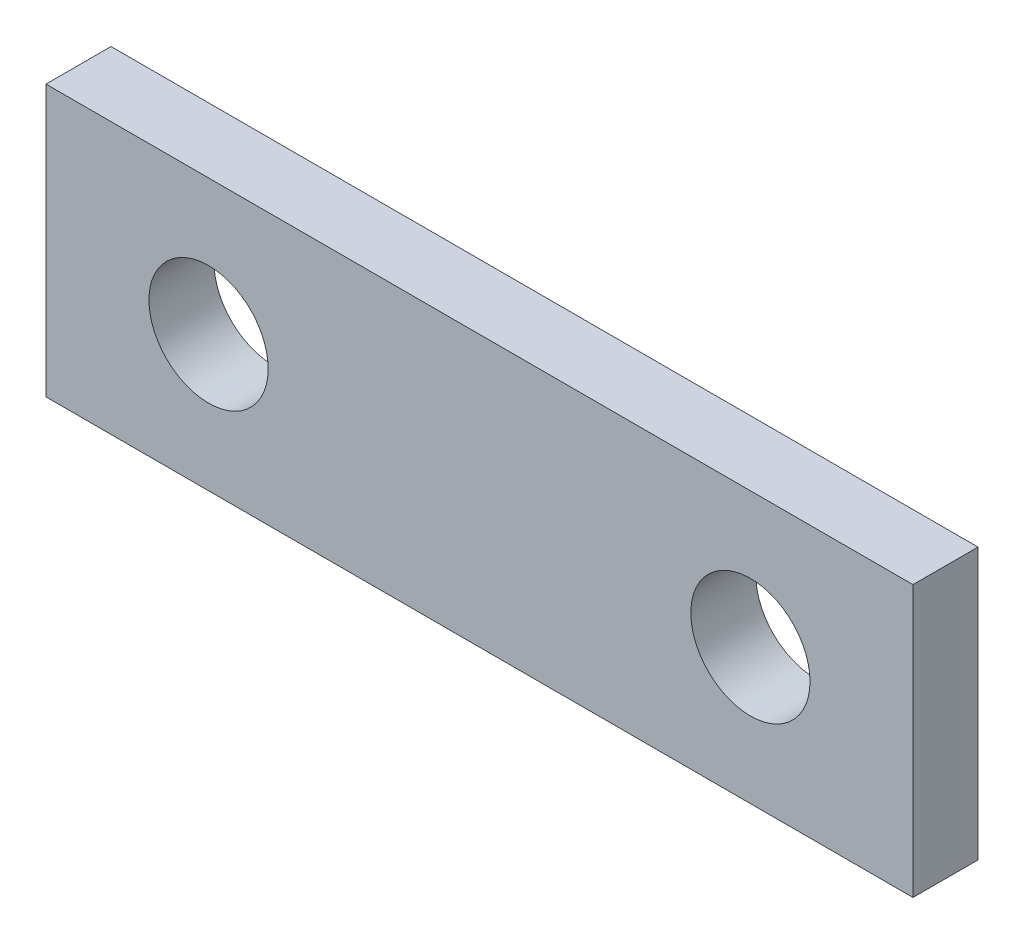
ISO-10303-21;
HEADER;
FILE_DESCRIPTION(('STEP AP214'),'2;1');
FILE_NAME('part.step','',(''),(''),'','','');
FILE_SCHEMA(('AUTOMOTIVE_DESIGN { 1 0 10303 214 1 1 1 1 }'));
ENDSEC;
DATA;
#1=APPLICATION_CONTEXT('core data for automotive mechanical design processes');
#2=APPLICATION_PROTOCOL_DEFINITION('international standard','automotive_design',2000,#1);
#3=PRODUCT_CONTEXT('',#1,'mechanical');
#4=PRODUCT('Part','Part','',(#3));
#5=PRODUCT_RELATED_PRODUCT_CATEGORY('part','',(#4));
#6=PRODUCT_DEFINITION_FORMATION('','',#4);
#7=PRODUCT_DEFINITION_CONTEXT('part definition',#1,'design');
#8=PRODUCT_DEFINITION('design','',#6,#7);
#9=PRODUCT_DEFINITION_SHAPE('','',#8);
#10=(LENGTH_UNIT() NAMED_UNIT(*) SI_UNIT(.MILLI.,.METRE.));
#11=(NAMED_UNIT(*) PLANE_ANGLE_UNIT() SI_UNIT($,.RADIAN.));
#12=(NAMED_UNIT(*) SI_UNIT($,.STERADIAN.) SOLID_ANGLE_UNIT());
#13=UNCERTAINTY_MEASURE_WITH_UNIT(LENGTH_MEASURE(1.E-05),#10,'distance_accuracy_value','');
#14=(GEOMETRIC_REPRESENTATION_CONTEXT(3) GLOBAL_UNCERTAINTY_ASSIGNED_CONTEXT((#13)) GLOBAL_UNIT_ASSIGNED_CONTEXT((#10,
#11,#12)) REPRESENTATION_CONTEXT('',''));
#15=CARTESIAN_POINT('',(0.,0.,0.));
#16=DIRECTION('',(0.,0.,1.));
#17=DIRECTION('',(1.,0.,0.));
#18=AXIS2_PLACEMENT_3D('',#15,#16,#17);
#19=CARTESIAN_POINT('',(0.,0.,3.));
#20=DIRECTION('',(0.,0.,1.));
#21=DIRECTION('',(1.,0.,0.));
#22=AXIS2_PLACEMENT_3D('',#19,#20,#21);
#23=PLANE('',#22);
#24=CARTESIAN_POINT('',(-25.,0.,3.));
#25=DIRECTION('',(0.,0.,1.));
#26=DIRECTION('',(1.,0.,0.));
#27=AXIS2_PLACEMENT_3D('',#24,#25,#26);
#28=CIRCLE('',#27,5.5);
#29=CARTESIAN_POINT('',(-19.5,0.,3.));
#30=VERTEX_POINT('',#29);
#31=EDGE_CURVE('E118',#30,#30,#28,.T.);
#32=ORIENTED_EDGE('',*,*,#31,.F.);
#33=EDGE_LOOP('',(#32));
#34=FACE_BOUND('',#33,.T.);
#35=DIRECTION('',(0.,-1.,0.));
#36=VECTOR('',#35,1.);
#37=CARTESIAN_POINT('',(-40.,12.5,3.));
#38=LINE('',#37,#36);
#39=CARTESIAN_POINT('',(-40.,12.5,3.));
#40=VERTEX_POINT('',#39);
#41=CARTESIAN_POINT('',(-40.,-12.5,3.));
#42=VERTEX_POINT('',#41);
#43=EDGE_CURVE('E98',#40,#42,#38,.T.);
#44=ORIENTED_EDGE('',*,*,#43,.T.);
#45=DIRECTION('',(1.,0.,0.));
#46=VECTOR('',#45,1.);
#47=CARTESIAN_POINT('',(-40.,-12.5,3.));
#48=LINE('',#47,#46);
#49=CARTESIAN_POINT('',(40.,-12.5,3.));
#50=VERTEX_POINT('',#49);
#51=EDGE_CURVE('E93',#42,#50,#48,.T.);
#52=ORIENTED_EDGE('',*,*,#51,.T.);
#53=DIRECTION('',(0.,1.,0.));
#54=VECTOR('',#53,1.);
#55=CARTESIAN_POINT('',(40.,12.5,3.));
#56=LINE('',#55,#54);
#57=CARTESIAN_POINT('',(40.,12.5,3.));
#58=VERTEX_POINT('',#57);
#59=EDGE_CURVE('E96',#50,#58,#56,.T.);
#60=ORIENTED_EDGE('',*,*,#59,.T.);
#61=DIRECTION('',(-1.,0.,0.));
#62=VECTOR('',#61,1.);
#63=CARTESIAN_POINT('',(-40.,12.5,3.));
#64=LINE('',#63,#62);
#65=EDGE_CURVE('E63',#58,#40,#64,.T.);
#66=ORIENTED_EDGE('',*,*,#65,.T.);
#67=EDGE_LOOP('',(#44,#52,#60,#66));
#68=FACE_BOUND('',#67,.T.);
#69=CARTESIAN_POINT('',(25.,0.,3.));
#70=DIRECTION('',(0.,0.,1.));
#71=DIRECTION('',(1.,0.,0.));
#72=AXIS2_PLACEMENT_3D('',#69,#70,#71);
#73=CIRCLE('',#72,5.5);
#74=CARTESIAN_POINT('',(30.5,0.,3.));
#75=VERTEX_POINT('',#74);
#76=EDGE_CURVE('E140',#75,#75,#73,.T.);
#77=ORIENTED_EDGE('',*,*,#76,.F.);
#78=EDGE_LOOP('',(#77));
#79=FACE_BOUND('',#78,.T.);
#80=ADVANCED_FACE('F45',(#34,#68,#79),#23,.T.);
#81=CARTESIAN_POINT('',(0.,0.,-3.));
#82=DIRECTION('',(0.,0.,1.));
#83=DIRECTION('',(1.,0.,0.));
#84=AXIS2_PLACEMENT_3D('',#81,#82,#83);
#85=PLANE('',#84);
#86=DIRECTION('',(0.,-1.,0.));
#87=VECTOR('',#86,1.);
#88=CARTESIAN_POINT('',(-40.,12.5,-3.));
#89=LINE('',#88,#87);
#90=CARTESIAN_POINT('',(-40.,12.5,-3.));
#91=VERTEX_POINT('',#90);
#92=CARTESIAN_POINT('',(-40.,-12.5,-3.));
#93=VERTEX_POINT('',#92);
#94=EDGE_CURVE('E114',#91,#93,#89,.T.);
#95=ORIENTED_EDGE('',*,*,#94,.F.);
#96=DIRECTION('',(-1.,0.,0.));
#97=VECTOR('',#96,1.);
#98=CARTESIAN_POINT('',(-40.,12.5,-3.));
#99=LINE('',#98,#97);
#100=CARTESIAN_POINT('',(40.,12.5,-3.));
#101=VERTEX_POINT('',#100);
#102=EDGE_CURVE('E86',#101,#91,#99,.T.);
#103=ORIENTED_EDGE('',*,*,#102,.F.);
#104=DIRECTION('',(0.,1.,0.));
#105=VECTOR('',#104,1.);
#106=CARTESIAN_POINT('',(40.,12.5,-3.));
#107=LINE('',#106,#105);
#108=CARTESIAN_POINT('',(40.,-12.5,-3.));
#109=VERTEX_POINT('',#108);
#110=EDGE_CURVE('E80',#109,#101,#107,.T.);
#111=ORIENTED_EDGE('',*,*,#110,.F.);
#112=DIRECTION('',(1.,0.,0.));
#113=VECTOR('',#112,1.);
#114=CARTESIAN_POINT('',(-40.,-12.5,-3.));
#115=LINE('',#114,#113);
#116=EDGE_CURVE('E103',#93,#109,#115,.T.);
#117=ORIENTED_EDGE('',*,*,#116,.F.);
#118=EDGE_LOOP('',(#95,#103,#111,#117));
#119=FACE_BOUND('',#118,.T.);
#120=CARTESIAN_POINT('',(-25.,0.,-3.));
#121=DIRECTION('',(0.,0.,1.));
#122=DIRECTION('',(1.,0.,0.));
#123=AXIS2_PLACEMENT_3D('',#120,#121,#122);
#124=CIRCLE('',#123,5.5);
#125=CARTESIAN_POINT('',(-19.5,0.,-3.));
#126=VERTEX_POINT('',#125);
#127=EDGE_CURVE('E136',#126,#126,#124,.T.);
#128=ORIENTED_EDGE('',*,*,#127,.T.);
#129=EDGE_LOOP('',(#128));
#130=FACE_BOUND('',#129,.T.);
#131=CARTESIAN_POINT('',(25.,0.,-3.));
#132=DIRECTION('',(0.,0.,1.));
#133=DIRECTION('',(1.,0.,0.));
#134=AXIS2_PLACEMENT_3D('',#131,#132,#133);
#135=CIRCLE('',#134,5.5);
#136=CARTESIAN_POINT('',(30.5,0.,-3.));
#137=VERTEX_POINT('',#136);
#138=EDGE_CURVE('E144',#137,#137,#135,.T.);
#139=ORIENTED_EDGE('',*,*,#138,.T.);
#140=EDGE_LOOP('',(#139));
#141=FACE_BOUND('',#140,.T.);
#142=ADVANCED_FACE('F131',(#119,#130,#141),#85,.F.);
#143=CARTESIAN_POINT('',(-40.,12.5,3.));
#144=DIRECTION('',(1.,0.,0.));
#145=DIRECTION('',(0.,0.,-1.));
#146=AXIS2_PLACEMENT_3D('',#143,#144,#145);
#147=PLANE('',#146);
#148=ORIENTED_EDGE('',*,*,#94,.T.);
#149=DIRECTION('',(0.,0.,-1.));
#150=VECTOR('',#149,1.);
#151=CARTESIAN_POINT('',(-40.,-12.5,3.));
#152=LINE('',#151,#150);
#153=EDGE_CURVE('E11',#42,#93,#152,.T.);
#154=ORIENTED_EDGE('',*,*,#153,.F.);
#155=ORIENTED_EDGE('',*,*,#43,.F.);
#156=DIRECTION('',(0.,0.,-1.));
#157=VECTOR('',#156,1.);
#158=CARTESIAN_POINT('',(-40.,12.5,3.));
#159=LINE('',#158,#157);
#160=EDGE_CURVE('E110',#40,#91,#159,.T.);
#161=ORIENTED_EDGE('',*,*,#160,.T.);
#162=EDGE_LOOP('',(#148,#154,#155,#161));
#163=FACE_BOUND('',#162,.T.);
#164=ADVANCED_FACE('F47',(#163),#147,.F.);
#165=CARTESIAN_POINT('',(-40.,-12.5,3.));
#166=DIRECTION('',(0.,1.,0.));
#167=DIRECTION('',(0.,0.,1.));
#168=AXIS2_PLACEMENT_3D('',#165,#166,#167);
#169=PLANE('',#168);
#170=ORIENTED_EDGE('',*,*,#116,.T.);
#171=DIRECTION('',(0.,0.,-1.));
#172=VECTOR('',#171,1.);
#173=CARTESIAN_POINT('',(40.,-12.5,3.));
#174=LINE('',#173,#172);
#175=EDGE_CURVE('E55',#50,#109,#174,.T.);
#176=ORIENTED_EDGE('',*,*,#175,.F.);
#177=ORIENTED_EDGE('',*,*,#51,.F.);
#178=ORIENTED_EDGE('',*,*,#153,.T.);
#179=EDGE_LOOP('',(#170,#176,#177,#178));
#180=FACE_BOUND('',#179,.T.);
#181=ADVANCED_FACE('F102',(#180),#169,.F.);
#182=CARTESIAN_POINT('',(40.,12.5,3.));
#183=DIRECTION('',(-1.,0.,0.));
#184=DIRECTION('',(0.,-1.,0.));
#185=AXIS2_PLACEMENT_3D('',#182,#183,#184);
#186=PLANE('',#185);
#187=ORIENTED_EDGE('',*,*,#110,.T.);
#188=DIRECTION('',(0.,0.,-1.));
#189=VECTOR('',#188,1.);
#190=CARTESIAN_POINT('',(40.,12.5,3.));
#191=LINE('',#190,#189);
#192=EDGE_CURVE('E105',#58,#101,#191,.T.);
#193=ORIENTED_EDGE('',*,*,#192,.F.);
#194=ORIENTED_EDGE('',*,*,#59,.F.);
#195=ORIENTED_EDGE('',*,*,#175,.T.);
#196=EDGE_LOOP('',(#187,#193,#194,#195));
#197=FACE_BOUND('',#196,.T.);
#198=ADVANCED_FACE('F106',(#197),#186,.F.);
#199=CARTESIAN_POINT('',(-40.,12.5,3.));
#200=DIRECTION('',(0.,-1.,0.));
#201=DIRECTION('',(0.,0.,-1.));
#202=AXIS2_PLACEMENT_3D('',#199,#200,#201);
#203=PLANE('',#202);
#204=ORIENTED_EDGE('',*,*,#102,.T.);
#205=ORIENTED_EDGE('',*,*,#160,.F.);
#206=ORIENTED_EDGE('',*,*,#65,.F.);
#207=ORIENTED_EDGE('',*,*,#192,.T.);
#208=EDGE_LOOP('',(#204,#205,#206,#207));
#209=FACE_BOUND('',#208,.T.);
#210=ADVANCED_FACE('F128',(#209),#203,.F.);
#211=CARTESIAN_POINT('',(-25.,0.,3.));
#212=DIRECTION('',(0.,0.,-1.));
#213=DIRECTION('',(-1.,0.,0.));
#214=AXIS2_PLACEMENT_3D('',#211,#212,#213);
#215=CYLINDRICAL_SURFACE('',#214,5.5);
#216=ORIENTED_EDGE('',*,*,#31,.T.);
#217=EDGE_LOOP('',(#216));
#218=FACE_BOUND('',#217,.T.);
#219=ORIENTED_EDGE('',*,*,#127,.F.);
#220=EDGE_LOOP('',(#219));
#221=FACE_BOUND('',#220,.T.);
#222=ADVANCED_FACE('F163',(#218,#221),#215,.F.);
#223=CARTESIAN_POINT('',(25.,0.,3.));
#224=DIRECTION('',(0.,0.,-1.));
#225=DIRECTION('',(-1.,0.,0.));
#226=AXIS2_PLACEMENT_3D('',#223,#224,#225);
#227=CYLINDRICAL_SURFACE('',#226,5.5);
#228=ORIENTED_EDGE('',*,*,#76,.T.);
#229=EDGE_LOOP('',(#228));
#230=FACE_BOUND('',#229,.T.);
#231=ORIENTED_EDGE('',*,*,#138,.F.);
#232=EDGE_LOOP('',(#231));
#233=FACE_BOUND('',#232,.T.);
#234=ADVANCED_FACE('F152',(#230,#233),#227,.F.);
#235=CLOSED_SHELL('',(#80,#142,#164,#181,#198,#210,#222,#234));
#236=MANIFOLD_SOLID_BREP('B2',#235);
#237=ADVANCED_BREP_SHAPE_REPRESENTATION('',(#18,#236),#14);
#238=SHAPE_DEFINITION_REPRESENTATION(#9,#237);
ENDSEC;
END-ISO-10303-21;
